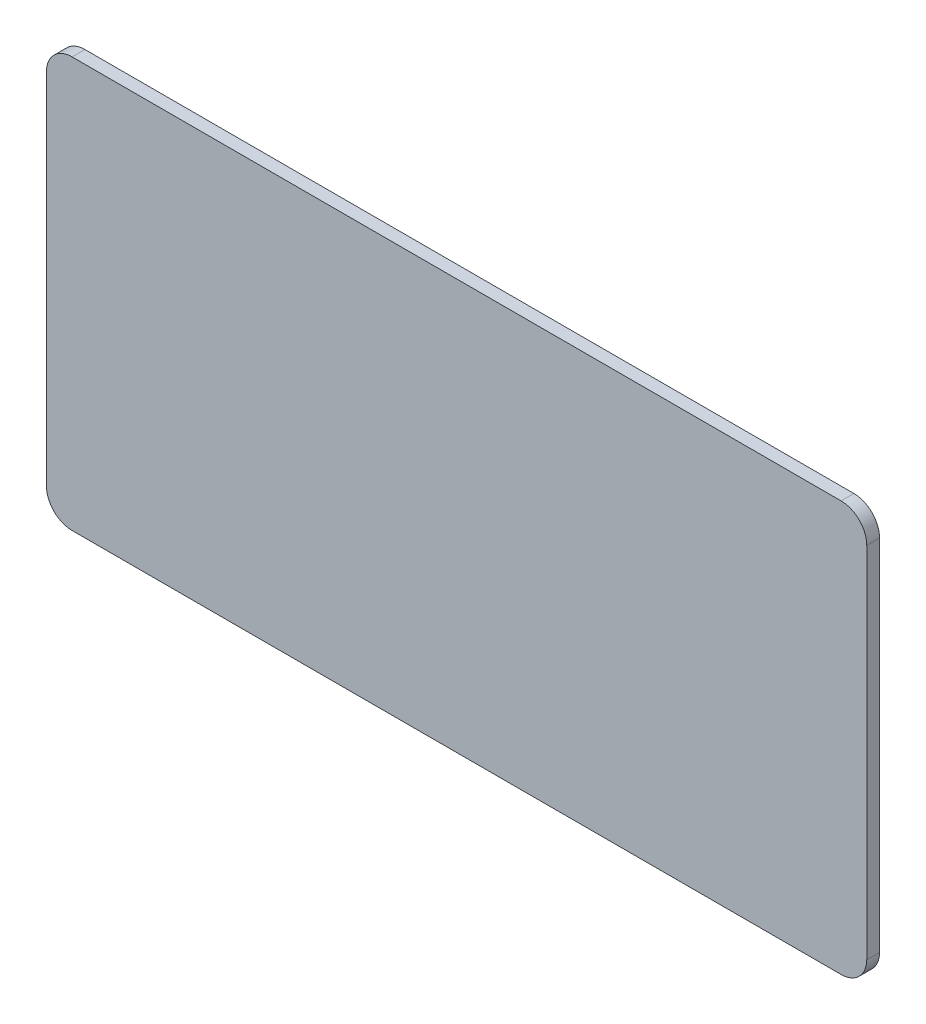
ISO-10303-21;
HEADER;
FILE_DESCRIPTION(('STEP AP214'),'2;1');
FILE_NAME('part.step','',(''),(''),'','','');
FILE_SCHEMA(('AUTOMOTIVE_DESIGN { 1 0 10303 214 1 1 1 1 }'));
ENDSEC;
DATA;
#1=APPLICATION_CONTEXT('core data for automotive mechanical design processes');
#2=APPLICATION_PROTOCOL_DEFINITION('international standard','automotive_design',2000,#1);
#3=PRODUCT_CONTEXT('',#1,'mechanical');
#4=PRODUCT('Part','Part','',(#3));
#5=PRODUCT_RELATED_PRODUCT_CATEGORY('part','',(#4));
#6=PRODUCT_DEFINITION_FORMATION('','',#4);
#7=PRODUCT_DEFINITION_CONTEXT('part definition',#1,'design');
#8=PRODUCT_DEFINITION('design','',#6,#7);
#9=PRODUCT_DEFINITION_SHAPE('','',#8);
#10=(LENGTH_UNIT() NAMED_UNIT(*) SI_UNIT(.MILLI.,.METRE.));
#11=(NAMED_UNIT(*) PLANE_ANGLE_UNIT() SI_UNIT($,.RADIAN.));
#12=(NAMED_UNIT(*) SI_UNIT($,.STERADIAN.) SOLID_ANGLE_UNIT());
#13=UNCERTAINTY_MEASURE_WITH_UNIT(LENGTH_MEASURE(1.E-05),#10,'distance_accuracy_value','');
#14=(GEOMETRIC_REPRESENTATION_CONTEXT(3) GLOBAL_UNCERTAINTY_ASSIGNED_CONTEXT((#13)) GLOBAL_UNIT_ASSIGNED_CONTEXT((#10,
#11,#12)) REPRESENTATION_CONTEXT('',''));
#15=CARTESIAN_POINT('',(0.,0.,0.));
#16=DIRECTION('',(0.,0.,1.));
#17=DIRECTION('',(1.,0.,0.));
#18=AXIS2_PLACEMENT_3D('',#15,#16,#17);
#19=CARTESIAN_POINT('',(150.,-70.,-5.));
#20=DIRECTION('',(0.,0.,1.));
#21=DIRECTION('',(1.,0.,0.));
#22=AXIS2_PLACEMENT_3D('',#19,#20,#21);
#23=CYLINDRICAL_SURFACE('',#22,10.);
#24=CARTESIAN_POINT('',(150.,-70.,0.));
#25=DIRECTION('',(0.,0.,1.));
#26=DIRECTION('',(1.,0.,0.));
#27=AXIS2_PLACEMENT_3D('',#24,#25,#26);
#28=CIRCLE('',#27,10.);
#29=CARTESIAN_POINT('',(150.,-80.,0.));
#30=VERTEX_POINT('',#29);
#31=CARTESIAN_POINT('',(160.,-70.,0.));
#32=VERTEX_POINT('',#31);
#33=EDGE_CURVE('E132',#30,#32,#28,.T.);
#34=ORIENTED_EDGE('',*,*,#33,.F.);
#35=DIRECTION('',(0.,0.,1.));
#36=VECTOR('',#35,1.);
#37=CARTESIAN_POINT('',(150.,-80.,-5.));
#38=LINE('',#37,#36);
#39=CARTESIAN_POINT('',(150.,-80.,-5.));
#40=VERTEX_POINT('',#39);
#41=EDGE_CURVE('E11',#40,#30,#38,.T.);
#42=ORIENTED_EDGE('',*,*,#41,.F.);
#43=CARTESIAN_POINT('',(150.,-70.,-5.));
#44=DIRECTION('',(0.,0.,1.));
#45=DIRECTION('',(1.,0.,0.));
#46=AXIS2_PLACEMENT_3D('',#43,#44,#45);
#47=CIRCLE('',#46,10.);
#48=CARTESIAN_POINT('',(160.,-70.,-5.));
#49=VERTEX_POINT('',#48);
#50=EDGE_CURVE('E152',#40,#49,#47,.T.);
#51=ORIENTED_EDGE('',*,*,#50,.T.);
#52=DIRECTION('',(0.,0.,1.));
#53=VECTOR('',#52,1.);
#54=CARTESIAN_POINT('',(160.,-70.,-5.));
#55=LINE('',#54,#53);
#56=EDGE_CURVE('E38',#49,#32,#55,.T.);
#57=ORIENTED_EDGE('',*,*,#56,.T.);
#58=EDGE_LOOP('',(#34,#42,#51,#57));
#59=FACE_BOUND('',#58,.T.);
#60=ADVANCED_FACE('F35',(#59),#23,.T.);
#61=CARTESIAN_POINT('',(-150.,-80.,-5.));
#62=DIRECTION('',(0.,-1.,0.));
#63=DIRECTION('',(0.,0.,-1.));
#64=AXIS2_PLACEMENT_3D('',#61,#62,#63);
#65=PLANE('',#64);
#66=DIRECTION('',(1.,0.,0.));
#67=VECTOR('',#66,1.);
#68=CARTESIAN_POINT('',(-150.,-80.,0.));
#69=LINE('',#68,#67);
#70=CARTESIAN_POINT('',(-150.,-80.,0.));
#71=VERTEX_POINT('',#70);
#72=EDGE_CURVE('E150',#71,#30,#69,.T.);
#73=ORIENTED_EDGE('',*,*,#72,.F.);
#74=DIRECTION('',(0.,0.,1.));
#75=VECTOR('',#74,1.);
#76=CARTESIAN_POINT('',(-150.,-80.,-5.));
#77=LINE('',#76,#75);
#78=CARTESIAN_POINT('',(-150.,-80.,-5.));
#79=VERTEX_POINT('',#78);
#80=EDGE_CURVE('E44',#79,#71,#77,.T.);
#81=ORIENTED_EDGE('',*,*,#80,.F.);
#82=DIRECTION('',(1.,0.,0.));
#83=VECTOR('',#82,1.);
#84=CARTESIAN_POINT('',(-150.,-80.,-5.));
#85=LINE('',#84,#83);
#86=EDGE_CURVE('E122',#79,#40,#85,.T.);
#87=ORIENTED_EDGE('',*,*,#86,.T.);
#88=ORIENTED_EDGE('',*,*,#41,.T.);
#89=EDGE_LOOP('',(#73,#81,#87,#88));
#90=FACE_BOUND('',#89,.T.);
#91=ADVANCED_FACE('F164',(#90),#65,.T.);
#92=CARTESIAN_POINT('',(-150.,-70.,-5.));
#93=DIRECTION('',(0.,0.,1.));
#94=DIRECTION('',(1.,0.,0.));
#95=AXIS2_PLACEMENT_3D('',#92,#93,#94);
#96=CYLINDRICAL_SURFACE('',#95,10.);
#97=CARTESIAN_POINT('',(-150.,-70.,0.));
#98=DIRECTION('',(0.,0.,1.));
#99=DIRECTION('',(1.,0.,0.));
#100=AXIS2_PLACEMENT_3D('',#97,#98,#99);
#101=CIRCLE('',#100,10.);
#102=CARTESIAN_POINT('',(-160.,-70.,0.));
#103=VERTEX_POINT('',#102);
#104=EDGE_CURVE('E109',#103,#71,#101,.T.);
#105=ORIENTED_EDGE('',*,*,#104,.F.);
#106=DIRECTION('',(0.,0.,1.));
#107=VECTOR('',#106,1.);
#108=CARTESIAN_POINT('',(-160.,-70.,-5.));
#109=LINE('',#108,#107);
#110=CARTESIAN_POINT('',(-160.,-70.,-5.));
#111=VERTEX_POINT('',#110);
#112=EDGE_CURVE('E104',#111,#103,#109,.T.);
#113=ORIENTED_EDGE('',*,*,#112,.F.);
#114=CARTESIAN_POINT('',(-150.,-70.,-5.));
#115=DIRECTION('',(0.,0.,1.));
#116=DIRECTION('',(1.,0.,0.));
#117=AXIS2_PLACEMENT_3D('',#114,#115,#116);
#118=CIRCLE('',#117,10.);
#119=EDGE_CURVE('E107',#111,#79,#118,.T.);
#120=ORIENTED_EDGE('',*,*,#119,.T.);
#121=ORIENTED_EDGE('',*,*,#80,.T.);
#122=EDGE_LOOP('',(#105,#113,#120,#121));
#123=FACE_BOUND('',#122,.T.);
#124=ADVANCED_FACE('F106',(#123),#96,.T.);
#125=CARTESIAN_POINT('',(-160.,70.,-5.));
#126=DIRECTION('',(-1.,0.,0.));
#127=DIRECTION('',(0.,-1.,0.));
#128=AXIS2_PLACEMENT_3D('',#125,#126,#127);
#129=PLANE('',#128);
#130=DIRECTION('',(0.,-1.,0.));
#131=VECTOR('',#130,1.);
#132=CARTESIAN_POINT('',(-160.,70.,0.));
#133=LINE('',#132,#131);
#134=CARTESIAN_POINT('',(-160.,70.,0.));
#135=VERTEX_POINT('',#134);
#136=EDGE_CURVE('E147',#135,#103,#133,.T.);
#137=ORIENTED_EDGE('',*,*,#136,.F.);
#138=DIRECTION('',(0.,0.,1.));
#139=VECTOR('',#138,1.);
#140=CARTESIAN_POINT('',(-160.,70.,-5.));
#141=LINE('',#140,#139);
#142=CARTESIAN_POINT('',(-160.,70.,-5.));
#143=VERTEX_POINT('',#142);
#144=EDGE_CURVE('E114',#143,#135,#141,.T.);
#145=ORIENTED_EDGE('',*,*,#144,.F.);
#146=DIRECTION('',(0.,-1.,0.));
#147=VECTOR('',#146,1.);
#148=CARTESIAN_POINT('',(-160.,70.,-5.));
#149=LINE('',#148,#147);
#150=EDGE_CURVE('E120',#143,#111,#149,.T.);
#151=ORIENTED_EDGE('',*,*,#150,.T.);
#152=ORIENTED_EDGE('',*,*,#112,.T.);
#153=EDGE_LOOP('',(#137,#145,#151,#152));
#154=FACE_BOUND('',#153,.T.);
#155=ADVANCED_FACE('F124',(#154),#129,.T.);
#156=CARTESIAN_POINT('',(-150.,70.,-5.));
#157=DIRECTION('',(0.,0.,1.));
#158=DIRECTION('',(1.,0.,0.));
#159=AXIS2_PLACEMENT_3D('',#156,#157,#158);
#160=CYLINDRICAL_SURFACE('',#159,10.);
#161=CARTESIAN_POINT('',(-150.,70.,0.));
#162=DIRECTION('',(0.,0.,1.));
#163=DIRECTION('',(1.,0.,0.));
#164=AXIS2_PLACEMENT_3D('',#161,#162,#163);
#165=CIRCLE('',#164,10.);
#166=CARTESIAN_POINT('',(-150.,80.,0.));
#167=VERTEX_POINT('',#166);
#168=EDGE_CURVE('E144',#167,#135,#165,.T.);
#169=ORIENTED_EDGE('',*,*,#168,.F.);
#170=DIRECTION('',(0.,0.,1.));
#171=VECTOR('',#170,1.);
#172=CARTESIAN_POINT('',(-150.,80.,-5.));
#173=LINE('',#172,#171);
#174=CARTESIAN_POINT('',(-150.,80.,-5.));
#175=VERTEX_POINT('',#174);
#176=EDGE_CURVE('E156',#175,#167,#173,.T.);
#177=ORIENTED_EDGE('',*,*,#176,.F.);
#178=CARTESIAN_POINT('',(-150.,70.,-5.));
#179=DIRECTION('',(0.,0.,1.));
#180=DIRECTION('',(1.,0.,0.));
#181=AXIS2_PLACEMENT_3D('',#178,#179,#180);
#182=CIRCLE('',#181,10.);
#183=EDGE_CURVE('E125',#175,#143,#182,.T.);
#184=ORIENTED_EDGE('',*,*,#183,.T.);
#185=ORIENTED_EDGE('',*,*,#144,.T.);
#186=EDGE_LOOP('',(#169,#177,#184,#185));
#187=FACE_BOUND('',#186,.T.);
#188=ADVANCED_FACE('F177',(#187),#160,.T.);
#189=CARTESIAN_POINT('',(-150.,80.,-5.));
#190=DIRECTION('',(0.,1.,0.));
#191=DIRECTION('',(-1.,0.,0.));
#192=AXIS2_PLACEMENT_3D('',#189,#190,#191);
#193=PLANE('',#192);
#194=DIRECTION('',(-1.,0.,0.));
#195=VECTOR('',#194,1.);
#196=CARTESIAN_POINT('',(-150.,80.,0.));
#197=LINE('',#196,#195);
#198=CARTESIAN_POINT('',(150.,80.,0.));
#199=VERTEX_POINT('',#198);
#200=EDGE_CURVE('E141',#199,#167,#197,.T.);
#201=ORIENTED_EDGE('',*,*,#200,.F.);
#202=DIRECTION('',(0.,0.,1.));
#203=VECTOR('',#202,1.);
#204=CARTESIAN_POINT('',(150.,80.,-5.));
#205=LINE('',#204,#203);
#206=CARTESIAN_POINT('',(150.,80.,-5.));
#207=VERTEX_POINT('',#206);
#208=EDGE_CURVE('E158',#207,#199,#205,.T.);
#209=ORIENTED_EDGE('',*,*,#208,.F.);
#210=DIRECTION('',(-1.,0.,0.));
#211=VECTOR('',#210,1.);
#212=CARTESIAN_POINT('',(-150.,80.,-5.));
#213=LINE('',#212,#211);
#214=EDGE_CURVE('E127',#207,#175,#213,.T.);
#215=ORIENTED_EDGE('',*,*,#214,.T.);
#216=ORIENTED_EDGE('',*,*,#176,.T.);
#217=EDGE_LOOP('',(#201,#209,#215,#216));
#218=FACE_BOUND('',#217,.T.);
#219=ADVANCED_FACE('F180',(#218),#193,.T.);
#220=CARTESIAN_POINT('',(150.,70.,-5.));
#221=DIRECTION('',(0.,0.,1.));
#222=DIRECTION('',(1.,0.,0.));
#223=AXIS2_PLACEMENT_3D('',#220,#221,#222);
#224=CYLINDRICAL_SURFACE('',#223,9.99999999999999);
#225=CARTESIAN_POINT('',(150.,70.,0.));
#226=DIRECTION('',(0.,0.,1.));
#227=DIRECTION('',(-1.,0.,0.));
#228=AXIS2_PLACEMENT_3D('',#225,#226,#227);
#229=CIRCLE('',#228,9.99999999999999);
#230=CARTESIAN_POINT('',(160.,70.,0.));
#231=VERTEX_POINT('',#230);
#232=EDGE_CURVE('E138',#231,#199,#229,.T.);
#233=ORIENTED_EDGE('',*,*,#232,.F.);
#234=DIRECTION('',(0.,0.,1.));
#235=VECTOR('',#234,1.);
#236=CARTESIAN_POINT('',(160.,70.,-5.));
#237=LINE('',#236,#235);
#238=CARTESIAN_POINT('',(160.,70.,-5.));
#239=VERTEX_POINT('',#238);
#240=EDGE_CURVE('E159',#239,#231,#237,.T.);
#241=ORIENTED_EDGE('',*,*,#240,.F.);
#242=CARTESIAN_POINT('',(150.,70.,-5.));
#243=DIRECTION('',(0.,0.,1.));
#244=DIRECTION('',(-1.,0.,0.));
#245=AXIS2_PLACEMENT_3D('',#242,#243,#244);
#246=CIRCLE('',#245,9.99999999999999);
#247=EDGE_CURVE('E255',#239,#207,#246,.T.);
#248=ORIENTED_EDGE('',*,*,#247,.T.);
#249=ORIENTED_EDGE('',*,*,#208,.T.);
#250=EDGE_LOOP('',(#233,#241,#248,#249));
#251=FACE_BOUND('',#250,.T.);
#252=ADVANCED_FACE('F184',(#251),#224,.T.);
#253=CARTESIAN_POINT('',(160.,70.,-5.));
#254=DIRECTION('',(1.,0.,0.));
#255=DIRECTION('',(0.,0.,-1.));
#256=AXIS2_PLACEMENT_3D('',#253,#254,#255);
#257=PLANE('',#256);
#258=DIRECTION('',(0.,1.,0.));
#259=VECTOR('',#258,1.);
#260=CARTESIAN_POINT('',(160.,70.,0.));
#261=LINE('',#260,#259);
#262=EDGE_CURVE('E135',#32,#231,#261,.T.);
#263=ORIENTED_EDGE('',*,*,#262,.F.);
#264=ORIENTED_EDGE('',*,*,#56,.F.);
#265=DIRECTION('',(0.,1.,0.));
#266=VECTOR('',#265,1.);
#267=CARTESIAN_POINT('',(160.,70.,-5.));
#268=LINE('',#267,#266);
#269=EDGE_CURVE('E256',#49,#239,#268,.T.);
#270=ORIENTED_EDGE('',*,*,#269,.T.);
#271=ORIENTED_EDGE('',*,*,#240,.T.);
#272=EDGE_LOOP('',(#263,#264,#270,#271));
#273=FACE_BOUND('',#272,.T.);
#274=ADVANCED_FACE('F161',(#273),#257,.T.);
#275=CARTESIAN_POINT('',(150.,-70.,-5.));
#276=DIRECTION('',(0.,0.,1.));
#277=DIRECTION('',(1.,0.,0.));
#278=AXIS2_PLACEMENT_3D('',#275,#276,#277);
#279=PLANE('',#278);
#280=ORIENTED_EDGE('',*,*,#50,.F.);
#281=ORIENTED_EDGE('',*,*,#86,.F.);
#282=ORIENTED_EDGE('',*,*,#119,.F.);
#283=ORIENTED_EDGE('',*,*,#150,.F.);
#284=ORIENTED_EDGE('',*,*,#183,.F.);
#285=ORIENTED_EDGE('',*,*,#214,.F.);
#286=ORIENTED_EDGE('',*,*,#247,.F.);
#287=ORIENTED_EDGE('',*,*,#269,.F.);
#288=EDGE_LOOP('',(#280,#281,#282,#283,#284,#285,#286,#287));
#289=FACE_BOUND('',#288,.T.);
#290=ADVANCED_FACE('F118',(#289),#279,.F.);
#291=CARTESIAN_POINT('',(150.,-70.,0.));
#292=DIRECTION('',(0.,0.,1.));
#293=DIRECTION('',(1.,0.,0.));
#294=AXIS2_PLACEMENT_3D('',#291,#292,#293);
#295=PLANE('',#294);
#296=ORIENTED_EDGE('',*,*,#33,.T.);
#297=ORIENTED_EDGE('',*,*,#262,.T.);
#298=ORIENTED_EDGE('',*,*,#232,.T.);
#299=ORIENTED_EDGE('',*,*,#200,.T.);
#300=ORIENTED_EDGE('',*,*,#168,.T.);
#301=ORIENTED_EDGE('',*,*,#136,.T.);
#302=ORIENTED_EDGE('',*,*,#104,.T.);
#303=ORIENTED_EDGE('',*,*,#72,.T.);
#304=EDGE_LOOP('',(#296,#297,#298,#299,#300,#301,#302,#303));
#305=FACE_BOUND('',#304,.T.);
#306=ADVANCED_FACE('F163',(#305),#295,.T.);
#307=CLOSED_SHELL('',(#60,#91,#124,#155,#188,#219,#252,#274,#290,#306));
#308=MANIFOLD_SOLID_BREP('B2',#307);
#309=ADVANCED_BREP_SHAPE_REPRESENTATION('',(#18,#308),#14);
#310=SHAPE_DEFINITION_REPRESENTATION(#9,#309);
ENDSEC;
END-ISO-10303-21;
